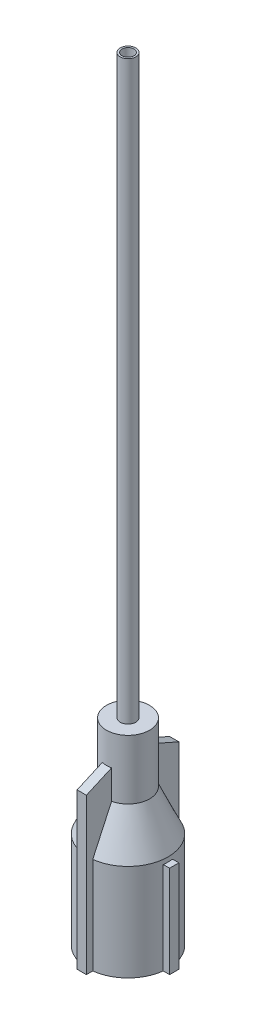
ISO-10303-21;
HEADER;
FILE_DESCRIPTION(('STEP AP214'),'2;1');
FILE_NAME('part.step','',(''),(''),'','','');
FILE_SCHEMA(('AUTOMOTIVE_DESIGN { 1 0 10303 214 1 1 1 1 }'));
ENDSEC;
DATA;
#1=APPLICATION_CONTEXT('core data for automotive mechanical design processes');
#2=APPLICATION_PROTOCOL_DEFINITION('international standard','automotive_design',2000,#1);
#3=PRODUCT_CONTEXT('',#1,'mechanical');
#4=PRODUCT('Part','Part','',(#3));
#5=PRODUCT_RELATED_PRODUCT_CATEGORY('part','',(#4));
#6=PRODUCT_DEFINITION_FORMATION('','',#4);
#7=PRODUCT_DEFINITION_CONTEXT('part definition',#1,'design');
#8=PRODUCT_DEFINITION('design','',#6,#7);
#9=PRODUCT_DEFINITION_SHAPE('','',#8);
#10=(LENGTH_UNIT() NAMED_UNIT(*) SI_UNIT(.MILLI.,.METRE.));
#11=(NAMED_UNIT(*) PLANE_ANGLE_UNIT() SI_UNIT($,.RADIAN.));
#12=(NAMED_UNIT(*) SI_UNIT($,.STERADIAN.) SOLID_ANGLE_UNIT());
#13=UNCERTAINTY_MEASURE_WITH_UNIT(LENGTH_MEASURE(1.E-05),#10,'distance_accuracy_value','');
#14=(GEOMETRIC_REPRESENTATION_CONTEXT(3) GLOBAL_UNCERTAINTY_ASSIGNED_CONTEXT((#13)) GLOBAL_UNIT_ASSIGNED_CONTEXT((#10,
#11,#12)) REPRESENTATION_CONTEXT('',''));
#15=CARTESIAN_POINT('',(0.,0.,0.));
#16=DIRECTION('',(0.,0.,1.));
#17=DIRECTION('',(1.,0.,0.));
#18=AXIS2_PLACEMENT_3D('',#15,#16,#17);
#19=CARTESIAN_POINT('',(0.,4.318,0.));
#20=DIRECTION('',(0.,1.,0.));
#21=DIRECTION('',(0.,0.,1.));
#22=AXIS2_PLACEMENT_3D('',#19,#20,#21);
#23=PLANE('',#22);
#24=DIRECTION('',(0.,0.,-1.));
#25=VECTOR('',#24,1.);
#26=CARTESIAN_POINT('',(3.15908511281352,4.318,-0.3175));
#27=LINE('',#26,#25);
#28=CARTESIAN_POINT('',(3.15908511281352,4.318,0.3175));
#29=VERTEX_POINT('',#28);
#30=CARTESIAN_POINT('',(3.15908511281352,4.318,-0.3175));
#31=VERTEX_POINT('',#30);
#32=EDGE_CURVE('E380',#29,#31,#27,.T.);
#33=ORIENTED_EDGE('',*,*,#32,.F.);
#34=DIRECTION('',(1.,0.,0.));
#35=VECTOR('',#34,1.);
#36=CARTESIAN_POINT('',(-3.15908511281352,4.318,0.3175));
#37=LINE('',#36,#35);
#38=CARTESIAN_POINT('',(2.72476420814719,4.318,0.3175));
#39=VERTEX_POINT('',#38);
#40=EDGE_CURVE('E389',#39,#29,#37,.T.);
#41=ORIENTED_EDGE('',*,*,#40,.F.);
#42=CARTESIAN_POINT('',(0.,4.318,0.));
#43=DIRECTION('',(0.,1.,0.));
#44=DIRECTION('',(0.,0.,1.));
#45=AXIS2_PLACEMENT_3D('',#42,#43,#44);
#46=CIRCLE('',#45,2.7432);
#47=CARTESIAN_POINT('',(0.3175,4.318,2.72476420814719));
#48=VERTEX_POINT('',#47);
#49=EDGE_CURVE('E404',#48,#39,#46,.T.);
#50=ORIENTED_EDGE('',*,*,#49,.F.);
#51=DIRECTION('',(0.,0.,-1.));
#52=VECTOR('',#51,1.);
#53=CARTESIAN_POINT('',(0.3175,4.318,-3.15908511281352));
#54=LINE('',#53,#52);
#55=CARTESIAN_POINT('',(0.3175,4.318,3.15908511281352));
#56=VERTEX_POINT('',#55);
#57=EDGE_CURVE('E394',#56,#48,#54,.T.);
#58=ORIENTED_EDGE('',*,*,#57,.F.);
#59=DIRECTION('',(1.,0.,0.));
#60=VECTOR('',#59,1.);
#61=CARTESIAN_POINT('',(-0.3175,4.318,3.15908511281352));
#62=LINE('',#61,#60);
#63=CARTESIAN_POINT('',(-0.3175,4.318,3.15908511281352));
#64=VERTEX_POINT('',#63);
#65=EDGE_CURVE('E400',#64,#56,#62,.T.);
#66=ORIENTED_EDGE('',*,*,#65,.F.);
#67=DIRECTION('',(0.,0.,1.));
#68=VECTOR('',#67,1.);
#69=CARTESIAN_POINT('',(-0.3175,4.318,-3.15908511281352));
#70=LINE('',#69,#68);
#71=CARTESIAN_POINT('',(-0.3175,4.318,2.72476420814719));
#72=VERTEX_POINT('',#71);
#73=EDGE_CURVE('E391',#72,#64,#70,.T.);
#74=ORIENTED_EDGE('',*,*,#73,.F.);
#75=CARTESIAN_POINT('',(0.,4.318,0.));
#76=DIRECTION('',(0.,1.,0.));
#77=DIRECTION('',(0.,0.,1.));
#78=AXIS2_PLACEMENT_3D('',#75,#76,#77);
#79=CIRCLE('',#78,2.7432);
#80=CARTESIAN_POINT('',(-2.72476420814719,4.318,0.3175));
#81=VERTEX_POINT('',#80);
#82=EDGE_CURVE('E54',#81,#72,#79,.T.);
#83=ORIENTED_EDGE('',*,*,#82,.F.);
#84=DIRECTION('',(1.,0.,0.));
#85=VECTOR('',#84,1.);
#86=CARTESIAN_POINT('',(-3.15908511281352,4.318,0.3175));
#87=LINE('',#86,#85);
#88=CARTESIAN_POINT('',(-3.15908511281352,4.318,0.3175));
#89=VERTEX_POINT('',#88);
#90=EDGE_CURVE('E388',#89,#81,#87,.T.);
#91=ORIENTED_EDGE('',*,*,#90,.F.);
#92=DIRECTION('',(0.,0.,1.));
#93=VECTOR('',#92,1.);
#94=CARTESIAN_POINT('',(-3.15908511281352,4.318,-0.3175));
#95=LINE('',#94,#93);
#96=CARTESIAN_POINT('',(-3.15908511281352,4.318,-0.3175));
#97=VERTEX_POINT('',#96);
#98=EDGE_CURVE('E62',#97,#89,#95,.T.);
#99=ORIENTED_EDGE('',*,*,#98,.F.);
#100=DIRECTION('',(-1.,0.,0.));
#101=VECTOR('',#100,1.);
#102=CARTESIAN_POINT('',(-3.15908511281352,4.318,-0.3175));
#103=LINE('',#102,#101);
#104=CARTESIAN_POINT('',(-2.72476420814719,4.318,-0.3175));
#105=VERTEX_POINT('',#104);
#106=EDGE_CURVE('E70',#105,#97,#103,.T.);
#107=ORIENTED_EDGE('',*,*,#106,.F.);
#108=CARTESIAN_POINT('',(-0.3175,4.318,-2.72476420814719));
#109=VERTEX_POINT('',#108);
#110=EDGE_CURVE('E13',#109,#105,#79,.T.);
#111=ORIENTED_EDGE('',*,*,#110,.F.);
#112=DIRECTION('',(0.,0.,1.));
#113=VECTOR('',#112,1.);
#114=CARTESIAN_POINT('',(-0.3175,4.318,-3.15908511281352));
#115=LINE('',#114,#113);
#116=CARTESIAN_POINT('',(-0.3175,4.318,-3.15908511281352));
#117=VERTEX_POINT('',#116);
#118=EDGE_CURVE('E393',#117,#109,#115,.T.);
#119=ORIENTED_EDGE('',*,*,#118,.F.);
#120=DIRECTION('',(-1.,0.,0.));
#121=VECTOR('',#120,1.);
#122=CARTESIAN_POINT('',(-0.3175,4.318,-3.15908511281352));
#123=LINE('',#122,#121);
#124=CARTESIAN_POINT('',(0.3175,4.318,-3.15908511281352));
#125=VERTEX_POINT('',#124);
#126=EDGE_CURVE('E397',#125,#117,#123,.T.);
#127=ORIENTED_EDGE('',*,*,#126,.F.);
#128=DIRECTION('',(0.,0.,-1.));
#129=VECTOR('',#128,1.);
#130=CARTESIAN_POINT('',(0.3175,4.318,-3.15908511281352));
#131=LINE('',#130,#129);
#132=CARTESIAN_POINT('',(0.3175,4.318,-2.72476420814719));
#133=VERTEX_POINT('',#132);
#134=EDGE_CURVE('E396',#133,#125,#131,.T.);
#135=ORIENTED_EDGE('',*,*,#134,.F.);
#136=CARTESIAN_POINT('',(2.72476420814719,4.318,-0.3175));
#137=VERTEX_POINT('',#136);
#138=EDGE_CURVE('E399',#137,#133,#46,.T.);
#139=ORIENTED_EDGE('',*,*,#138,.F.);
#140=DIRECTION('',(-1.,0.,0.));
#141=VECTOR('',#140,1.);
#142=CARTESIAN_POINT('',(-3.15908511281352,4.318,-0.3175));
#143=LINE('',#142,#141);
#144=EDGE_CURVE('E49',#31,#137,#143,.T.);
#145=ORIENTED_EDGE('',*,*,#144,.F.);
#146=EDGE_LOOP('',(#33,#41,#50,#58,#66,#74,#83,#91,#99,#107,#111,#119,#127,#135,#139,#145));
#147=FACE_BOUND('',#146,.T.);
#148=CARTESIAN_POINT('',(0.,4.318,0.));
#149=DIRECTION('',(0.,1.,0.));
#150=DIRECTION('',(0.,0.,1.));
#151=AXIS2_PLACEMENT_3D('',#148,#149,#150);
#152=CIRCLE('',#151,2.1209);
#153=CARTESIAN_POINT('',(0.,4.318,2.1209));
#154=VERTEX_POINT('',#153);
#155=EDGE_CURVE('E336',#154,#154,#152,.F.);
#156=ORIENTED_EDGE('',*,*,#155,.F.);
#157=EDGE_LOOP('',(#156));
#158=FACE_BOUND('',#157,.T.);
#159=ADVANCED_FACE('F46',(#147,#158),#23,.F.);
#160=CARTESIAN_POINT('',(0.,115.80868302834,0.));
#161=DIRECTION('',(0.,-1.,0.));
#162=DIRECTION('',(0.,0.,-1.));
#163=AXIS2_PLACEMENT_3D('',#160,#161,#162);
#164=CYLINDRICAL_SURFACE('',#163,0.5334);
#165=CARTESIAN_POINT('',(0.,17.78,0.));
#166=DIRECTION('',(0.,1.,0.));
#167=DIRECTION('',(0.,0.,1.));
#168=AXIS2_PLACEMENT_3D('',#165,#166,#167);
#169=CIRCLE('',#168,0.5334);
#170=CARTESIAN_POINT('',(0.,17.78,0.5334));
#171=VERTEX_POINT('',#170);
#172=EDGE_CURVE('E333',#171,#171,#169,.T.);
#173=ORIENTED_EDGE('',*,*,#172,.T.);
#174=EDGE_LOOP('',(#173));
#175=FACE_BOUND('',#174,.T.);
#176=CARTESIAN_POINT('',(0.,57.15,0.));
#177=DIRECTION('',(0.,1.,0.));
#178=DIRECTION('',(0.,0.,1.));
#179=AXIS2_PLACEMENT_3D('',#176,#177,#178);
#180=CIRCLE('',#179,0.5334);
#181=CARTESIAN_POINT('',(0.,57.15,0.5334));
#182=VERTEX_POINT('',#181);
#183=EDGE_CURVE('E341',#182,#182,#180,.F.);
#184=ORIENTED_EDGE('',*,*,#183,.T.);
#185=EDGE_LOOP('',(#184));
#186=FACE_BOUND('',#185,.T.);
#187=ADVANCED_FACE('F367',(#175,#186),#164,.T.);
#188=CARTESIAN_POINT('',(-7.3025,15.6972,-3.15908511281352));
#189=DIRECTION('',(0.,1.,0.));
#190=DIRECTION('',(0.,0.,1.));
#191=AXIS2_PLACEMENT_3D('',#188,#189,#190);
#192=PLANE('',#191);
#193=CARTESIAN_POINT('',(0.,15.6972,0.));
#194=DIRECTION('',(0.,1.,0.));
#195=DIRECTION('',(0.,0.,1.));
#196=AXIS2_PLACEMENT_3D('',#193,#194,#195);
#197=CIRCLE('',#196,1.4732);
#198=CARTESIAN_POINT('',(-0.317500000000002,15.6972,-1.43857985179829));
#199=VERTEX_POINT('',#198);
#200=CARTESIAN_POINT('',(0.3175,15.6972,-1.43857985179829));
#201=VERTEX_POINT('',#200);
#202=EDGE_CURVE('E214',#199,#201,#197,.F.);
#203=ORIENTED_EDGE('',*,*,#202,.T.);
#204=DIRECTION('',(1.,0.,0.));
#205=VECTOR('',#204,1.);
#206=CARTESIAN_POINT('',(-7.3025,15.6972,-1.43857985179829));
#207=LINE('',#206,#205);
#208=EDGE_CURVE('E320',#199,#201,#207,.T.);
#209=ORIENTED_EDGE('',*,*,#208,.F.);
#210=EDGE_LOOP('',(#203,#209));
#211=FACE_BOUND('',#210,.T.);
#212=ADVANCED_FACE('F373',(#211),#192,.F.);
#213=CARTESIAN_POINT('',(0.,17.78,0.));
#214=DIRECTION('',(0.,1.,0.));
#215=DIRECTION('',(0.,0.,1.));
#216=AXIS2_PLACEMENT_3D('',#213,#214,#215);
#217=PLANE('',#216);
#218=ORIENTED_EDGE('',*,*,#172,.F.);
#219=EDGE_LOOP('',(#218));
#220=FACE_BOUND('',#219,.T.);
#221=CARTESIAN_POINT('',(0.,17.78,0.));
#222=DIRECTION('',(0.,1.,0.));
#223=DIRECTION('',(0.,0.,1.));
#224=AXIS2_PLACEMENT_3D('',#221,#222,#223);
#225=CIRCLE('',#224,1.4732);
#226=CARTESIAN_POINT('',(0.,17.78,1.4732));
#227=VERTEX_POINT('',#226);
#228=EDGE_CURVE('E215',#227,#227,#225,.T.);
#229=ORIENTED_EDGE('',*,*,#228,.T.);
#230=EDGE_LOOP('',(#229));
#231=FACE_BOUND('',#230,.T.);
#232=ADVANCED_FACE('F507',(#220,#231),#217,.T.);
#233=CARTESIAN_POINT('',(-7.3025,15.6972,1.43857985179829));
#234=DIRECTION('',(0.,1.,0.));
#235=DIRECTION('',(0.,0.,1.));
#236=AXIS2_PLACEMENT_3D('',#233,#234,#235);
#237=PLANE('',#236);
#238=CARTESIAN_POINT('',(0.3175,15.6972,1.43857985179829));
#239=VERTEX_POINT('',#238);
#240=CARTESIAN_POINT('',(-0.317500000000002,15.6972,1.43857985179829));
#241=VERTEX_POINT('',#240);
#242=EDGE_CURVE('E189',#239,#241,#197,.F.);
#243=ORIENTED_EDGE('',*,*,#242,.T.);
#244=DIRECTION('',(1.,0.,0.));
#245=VECTOR('',#244,1.);
#246=CARTESIAN_POINT('',(-7.3025,15.6972,1.43857985179829));
#247=LINE('',#246,#245);
#248=EDGE_CURVE('E185',#241,#239,#247,.T.);
#249=ORIENTED_EDGE('',*,*,#248,.T.);
#250=EDGE_LOOP('',(#243,#249));
#251=FACE_BOUND('',#250,.T.);
#252=ADVANCED_FACE('F187',(#251),#237,.F.);
#253=CARTESIAN_POINT('',(-7.3025,15.6972,-1.43857985179829));
#254=DIRECTION('',(0.,-0.914337198757473,0.404953684966982));
#255=DIRECTION('',(0.,-0.404953684966982,-0.914337198757473));
#256=AXIS2_PLACEMENT_3D('',#253,#254,#255);
#257=PLANE('',#256);
#258=ORIENTED_EDGE('',*,*,#208,.T.);
#259=DIRECTION('',(0.,-0.404953684966982,-0.914337198757473));
#260=VECTOR('',#259,1.);
#261=CARTESIAN_POINT('',(0.3175,15.6972,-1.43857985179829));
#262=LINE('',#261,#260);
#263=CARTESIAN_POINT('',(0.3175,14.9352,-3.15908511281352));
#264=VERTEX_POINT('',#263);
#265=EDGE_CURVE('E323',#201,#264,#262,.T.);
#266=ORIENTED_EDGE('',*,*,#265,.T.);
#267=DIRECTION('',(1.,0.,0.));
#268=VECTOR('',#267,1.);
#269=CARTESIAN_POINT('',(-7.3025,14.9352,-3.15908511281352));
#270=LINE('',#269,#268);
#271=CARTESIAN_POINT('',(-0.3175,14.9352,-3.15908511281352));
#272=VERTEX_POINT('',#271);
#273=EDGE_CURVE('E319',#272,#264,#270,.T.);
#274=ORIENTED_EDGE('',*,*,#273,.F.);
#275=DIRECTION('',(0.,-0.404953684966982,-0.914337198757473));
#276=VECTOR('',#275,1.);
#277=CARTESIAN_POINT('',(-0.3175,15.0601584650699,-2.87694377874383));
#278=LINE('',#277,#276);
#279=EDGE_CURVE('E316',#199,#272,#278,.T.);
#280=ORIENTED_EDGE('',*,*,#279,.F.);
#281=EDGE_LOOP('',(#258,#266,#274,#280));
#282=FACE_BOUND('',#281,.T.);
#283=ADVANCED_FACE('F498',(#282),#257,.F.);
#284=CARTESIAN_POINT('',(0.,13.716,0.));
#285=DIRECTION('',(0.,-1.,0.));
#286=DIRECTION('',(0.,0.,-1.));
#287=AXIS2_PLACEMENT_3D('',#284,#285,#286);
#288=CONICAL_SURFACE('',#287,1.4732,0.426627493126876);
#289=CARTESIAN_POINT('',(-0.3175,7.22767932714699,-4.41102480672568));
#290=CARTESIAN_POINT('',(-0.3175,7.7021106698669,-4.19480163593372));
#291=CARTESIAN_POINT('',(-0.3175,8.17652163046673,-3.97853367098987));
#292=CARTESIAN_POINT('',(-0.3175,9.1252505790544,-3.54576802046189));
#293=CARTESIAN_POINT('',(-0.3175,9.59956856492115,-3.32927033022839));
#294=CARTESIAN_POINT('',(-0.3175,10.5479583789697,-2.89595119700704));
#295=CARTESIAN_POINT('',(-0.3175,11.0220302354266,-2.67912981595699));
#296=CARTESIAN_POINT('',(-0.3175,11.7328764011325,-2.35333794758448));
#297=CARTESIAN_POINT('',(-0.3175,11.9697794111443,-2.24464832915866));
#298=CARTESIAN_POINT('',(-0.3175,12.4434520948054,-2.02697902218213));
#299=CARTESIAN_POINT('',(-0.3175,12.6802217685209,-1.91799933377566));
#300=CARTESIAN_POINT('',(-0.3175,13.0843295725296,-1.73150430729163));
#301=CARTESIAN_POINT('',(-0.3175,13.2517226186287,-1.65410799082424));
#302=CARTESIAN_POINT('',(-0.3175,13.5863487208074,-1.49895327810397));
#303=CARTESIAN_POINT('',(-0.3175,13.7535817706139,-1.42119486830339));
#304=CARTESIAN_POINT('',(-0.3175,14.0878037978454,-1.26508834298285));
#305=CARTESIAN_POINT('',(-0.3175,14.2547927337769,-1.18674013860669));
#306=CARTESIAN_POINT('',(-0.3175,14.5882884954842,-1.02906613000263));
#307=CARTESIAN_POINT('',(-0.3175,14.7547953723236,-0.949740434374789));
#308=CARTESIAN_POINT('',(-0.3175,15.0037781743311,-0.829246154237625));
#309=CARTESIAN_POINT('',(-0.3175,15.0866222224287,-0.788840737330407));
#310=CARTESIAN_POINT('',(-0.3175,15.2519357639856,-0.707211137899544));
#311=CARTESIAN_POINT('',(-0.3175,15.3344051425115,-0.665986722564364));
#312=CARTESIAN_POINT('',(-0.3175,15.4987490876982,-0.582193332007994));
#313=CARTESIAN_POINT('',(-0.3175,15.5806231387277,-0.539623330450745));
#314=CARTESIAN_POINT('',(-0.3175,15.7023956437923,-0.473880389828178));
#315=CARTESIAN_POINT('',(-0.3175,15.7428048004217,-0.45165640474891));
#316=CARTESIAN_POINT('',(-0.3175,15.8230874644223,-0.406264474078921));
#317=CARTESIAN_POINT('',(-0.3175,15.8629610584932,-0.383096683786355));
#318=CARTESIAN_POINT('',(-0.3175,15.9218400538252,-0.347371160104113));
#319=CARTESIAN_POINT('',(-0.3175,15.9411886901245,-0.335381134093842));
#320=CARTESIAN_POINT('',(-0.3175,15.979580480711,-0.310917780370954));
#321=CARTESIAN_POINT('',(-0.3175,15.9986236127448,-0.298444417675352));
#322=CARTESIAN_POINT('',(-0.3175,16.0362211538037,-0.272895179415757));
#323=CARTESIAN_POINT('',(-0.3175,16.0547769209849,-0.259821339655033));
#324=CARTESIAN_POINT('',(-0.3175,16.0912253300294,-0.232787238041285));
#325=CARTESIAN_POINT('',(-0.3175,16.1091178964841,-0.218826875873773));
#326=CARTESIAN_POINT('',(-0.3175,16.1496366461539,-0.184822510126191));
#327=CARTESIAN_POINT('',(-0.3175,16.1718840482779,-0.16428782169052));
#328=CARTESIAN_POINT('',(-0.3175,16.2022073654761,-0.130460393372264));
#329=CARTESIAN_POINT('',(-0.3175,16.2118539003325,-0.118602883955266));
#330=CARTESIAN_POINT('',(-0.3175,16.2292948533368,-0.0935863424134843));
#331=CARTESIAN_POINT('',(-0.3175,16.2370963025341,-0.0804325309107127));
#332=CARTESIAN_POINT('',(-0.3175,16.2470020273625,-0.058480457761505));
#333=CARTESIAN_POINT('',(-0.3175,16.2501257771589,-0.0501504550969108));
#334=CARTESIAN_POINT('',(-0.3175,16.2549996431112,-0.0330996577408318));
#335=CARTESIAN_POINT('',(-0.3175,16.2567522543127,-0.0243796035462129));
#336=CARTESIAN_POINT('',(-0.3175,16.2586558057003,-0.00669680389599933));
#337=CARTESIAN_POINT('',(-0.3175,16.2587953742625,0.00226721858937595));
#338=CARTESIAN_POINT('',(-0.3175,16.2574206264703,0.020069253483007));
#339=CARTESIAN_POINT('',(-0.3175,16.2559048128029,0.0289071444731656));
#340=CARTESIAN_POINT('',(-0.3175,16.2509530707759,0.0480738070442011));
#341=CARTESIAN_POINT('',(-0.3175,16.2471725102118,0.0583111450000653));
#342=CARTESIAN_POINT('',(-0.3175,16.2380540779672,0.0780624072184146));
#343=CARTESIAN_POINT('',(-0.3175,16.2327125003723,0.0875745412676681));
#344=CARTESIAN_POINT('',(-0.3175,16.2199926536065,0.107413138145903));
#345=CARTESIAN_POINT('',(-0.3175,16.212423710857,0.117614623300637));
#346=CARTESIAN_POINT('',(-0.3175,16.1963352377141,0.137248197102446));
#347=CARTESIAN_POINT('',(-0.3175,16.1878139939425,0.146678844332645));
#348=CARTESIAN_POINT('',(-0.3175,16.1700809478357,0.164975944958832));
#349=CARTESIAN_POINT('',(-0.3175,16.1608650915871,0.17383842080837));
#350=CARTESIAN_POINT('',(-0.3175,16.1419907214362,0.19105553887496));
#351=CARTESIAN_POINT('',(-0.3175,16.132332614341,0.199410631981544));
#352=CARTESIAN_POINT('',(-0.3175,16.1013339168907,0.225168535603576));
#353=CARTESIAN_POINT('',(-0.3175,16.079402931261,0.241857503806441));
#354=CARTESIAN_POINT('',(-0.3175,16.0346960659354,0.274071126844144));
#355=CARTESIAN_POINT('',(-0.3175,16.0119194785766,0.289594772054586));
#356=CARTESIAN_POINT('',(-0.3175,15.9427059604232,0.335050019394471));
#357=CARTESIAN_POINT('',(-0.3175,15.8954891386935,0.363787031853922));
#358=CARTESIAN_POINT('',(-0.3175,15.8000436263016,0.419607615059472));
#359=CARTESIAN_POINT('',(-0.3175,15.7518138204016,0.44668921960024));
#360=CARTESIAN_POINT('',(-0.3175,15.6548557945915,0.499758887550107));
#361=CARTESIAN_POINT('',(-0.3175,15.6061284863242,0.525748616948857));
#362=CARTESIAN_POINT('',(-0.3175,15.4604370911632,0.602177555958504));
#363=CARTESIAN_POINT('',(-0.3175,15.3629624872617,0.651636997317587));
#364=CARTESIAN_POINT('',(-0.3175,15.1673516294104,0.749238064179454));
#365=CARTESIAN_POINT('',(-0.3175,15.0692153134667,0.7973795640082));
#366=CARTESIAN_POINT('',(-0.3175,14.872479265547,0.892908502560198));
#367=CARTESIAN_POINT('',(-0.3175,14.7738792248004,0.940295304929104));
#368=CARTESIAN_POINT('',(-0.3175,14.5764424176428,1.03456117845374));
#369=CARTESIAN_POINT('',(-0.3175,14.4776056611519,1.08144027044678));
#370=CARTESIAN_POINT('',(-0.3175,14.181536310037,1.22125219555609));
#371=CARTESIAN_POINT('',(-0.3175,13.9840677517306,1.31368495889932));
#372=CARTESIAN_POINT('',(-0.3175,13.5888719078028,1.49783399248739));
#373=CARTESIAN_POINT('',(-0.3175,13.3911447205553,1.58955047456235));
#374=CARTESIAN_POINT('',(-0.3175,12.9459164305719,1.79550730293358));
#375=CARTESIAN_POINT('',(-0.3175,12.6983614964152,1.9096312685947));
#376=CARTESIAN_POINT('',(-0.3175,12.2030809475721,2.13750900113742));
#377=CARTESIAN_POINT('',(-0.3175,11.9553553325693,2.25126276733027));
#378=CARTESIAN_POINT('',(-0.3175,11.2119545386823,2.59220985859512));
#379=CARTESIAN_POINT('',(-0.3175,10.7161213495256,2.81905858675671));
#380=CARTESIAN_POINT('',(-0.3175,9.72154818333632,3.27358073909779));
#381=CARTESIAN_POINT('',(-0.3175,9.22280716129733,3.501251874118));
#382=CARTESIAN_POINT('',(-0.3175,8.22527751972674,3.95630562286426));
#383=CARTESIAN_POINT('',(-0.3175,7.72648891653276,4.18368827239904));
#384=CARTESIAN_POINT('',(-0.3175,7.22767932714699,4.41102480672568));
#385=B_SPLINE_CURVE_WITH_KNOTS('',3,(#289,#290,#291,#292,#293,#294,#295,#296,#297,#298,#299,
#300,#301,#302,#303,#304,#305,#306,#307,#308,#309,#310,#311,#312,#313,#314,#315,#316,#317,#318,
#319,#320,#321,#322,#323,#324,#325,#326,#327,#328,#329,#330,#331,#332,#333,#334,#335,#336,#337,
#338,#339,#340,#341,#342,#343,#344,#345,#346,#347,#348,#349,#350,#351,#352,#353,#354,#355,#356,
#357,#358,#359,#360,#361,#362,#363,#364,#365,#366,#367,#368,#369,#370,#371,#372,#373,#374,#375,
#376,#377,#378,#379,#380,#381,#382,#383,#384),.UNSPECIFIED.,.F.,.F.,(4,2,2,2,2,2,2,2,2,2,2,2,2,
2,2,2,2,2,2,2,2,2,2,2,2,2,2,2,2,2,2,2,2,2,2,2,2,2,2,2,2,2,2,2,2,2,2,4),(0.,1.56414133526905,
3.12831495479998,4.69222013577117,5.47415879826696,6.25609707199398,6.80935592824491,
7.36263565369306,7.91600047238721,8.46930435638963,8.74581794354609,9.02241129120681,
9.2992209564616,9.43756626673929,9.5758889042541,9.64417066382184,9.71245737475775,
9.78052756733815,9.84860547617722,9.93907552029508,9.9848426173377,10.0304323940226,
10.0570304090863,10.0835799107289,10.1103164677461,10.1370772283434,10.1696312059669,
10.202263104674,10.2402845141526,10.2783754678167,10.3167091145838,10.3550081817406,
10.4376100125381,10.5202826019894,10.6860180835875,10.851946737879,11.0176122697718,
11.345503117697,11.673425123939,12.0016103731399,12.3297821016229,12.9838726636833,
13.6377618463809,14.455544462398,15.2733285990193,16.9091146856415,18.5538610741755,
20.1983780896986),.UNSPECIFIED.);
#386=CARTESIAN_POINT('',(-0.3175,10.922,-2.72476420814719));
#387=VERTEX_POINT('',#386);
#388=CARTESIAN_POINT('',(-0.3175,13.716,-1.43857985179829));
#389=VERTEX_POINT('',#388);
#390=EDGE_CURVE('E240',#387,#389,#385,.T.);
#391=ORIENTED_EDGE('',*,*,#390,.F.);
#392=CARTESIAN_POINT('',(0.,10.922,0.));
#393=DIRECTION('',(0.,-1.,0.));
#394=DIRECTION('',(0.,0.,-1.));
#395=AXIS2_PLACEMENT_3D('',#392,#393,#394);
#396=CIRCLE('',#395,2.7432);
#397=CARTESIAN_POINT('',(-0.3175,10.922,2.72476420814719));
#398=VERTEX_POINT('',#397);
#399=EDGE_CURVE('E467',#398,#387,#396,.T.);
#400=ORIENTED_EDGE('',*,*,#399,.F.);
#401=CARTESIAN_POINT('',(-0.3175,13.716,1.43857985179829));
#402=VERTEX_POINT('',#401);
#403=EDGE_CURVE('E231',#402,#398,#385,.T.);
#404=ORIENTED_EDGE('',*,*,#403,.F.);
#405=CARTESIAN_POINT('',(0.,13.716,0.));
#406=DIRECTION('',(0.,-1.,0.));
#407=DIRECTION('',(0.,0.,-1.));
#408=AXIS2_PLACEMENT_3D('',#405,#406,#407);
#409=CIRCLE('',#408,1.4732);
#410=EDGE_CURVE('E487',#402,#389,#409,.T.);
#411=ORIENTED_EDGE('',*,*,#410,.T.);
#412=EDGE_LOOP('',(#391,#400,#404,#411));
#413=FACE_BOUND('',#412,.T.);
#414=ADVANCED_FACE('F242',(#413),#288,.T.);
#415=CARTESIAN_POINT('',(0.,17.78,0.));
#416=DIRECTION('',(0.,-1.,0.));
#417=DIRECTION('',(0.,0.,-1.));
#418=AXIS2_PLACEMENT_3D('',#415,#416,#417);
#419=CYLINDRICAL_SURFACE('',#418,2.7432);
#420=DIRECTION('',(0.,-1.,0.));
#421=VECTOR('',#420,1.);
#422=CARTESIAN_POINT('',(-0.3175,17.78,-2.72476420814719));
#423=LINE('',#422,#421);
#424=EDGE_CURVE('E460',#109,#387,#423,.F.);
#425=ORIENTED_EDGE('',*,*,#424,.F.);
#426=ORIENTED_EDGE('',*,*,#110,.T.);
#427=DIRECTION('',(0.,-1.,0.));
#428=VECTOR('',#427,1.);
#429=CARTESIAN_POINT('',(-2.72476420814719,17.78,-0.3175));
#430=LINE('',#429,#428);
#431=CARTESIAN_POINT('',(-2.72476420814719,10.6172,-0.3175));
#432=VERTEX_POINT('',#431);
#433=EDGE_CURVE('E288',#432,#105,#430,.T.);
#434=ORIENTED_EDGE('',*,*,#433,.F.);
#435=CARTESIAN_POINT('',(0.,10.6172,0.));
#436=DIRECTION('',(0.,1.,0.));
#437=DIRECTION('',(0.,0.,1.));
#438=AXIS2_PLACEMENT_3D('',#435,#436,#437);
#439=CIRCLE('',#438,2.7432);
#440=CARTESIAN_POINT('',(-2.72476420814719,10.6172,0.3175));
#441=VERTEX_POINT('',#440);
#442=EDGE_CURVE('E280',#432,#441,#439,.T.);
#443=ORIENTED_EDGE('',*,*,#442,.T.);
#444=DIRECTION('',(0.,-1.,0.));
#445=VECTOR('',#444,1.);
#446=CARTESIAN_POINT('',(-2.72476420814719,17.78,0.3175));
#447=LINE('',#446,#445);
#448=EDGE_CURVE('E283',#81,#441,#447,.F.);
#449=ORIENTED_EDGE('',*,*,#448,.F.);
#450=ORIENTED_EDGE('',*,*,#82,.T.);
#451=DIRECTION('',(0.,-1.,0.));
#452=VECTOR('',#451,1.);
#453=CARTESIAN_POINT('',(-0.3175,17.78,2.72476420814719));
#454=LINE('',#453,#452);
#455=EDGE_CURVE('E239',#398,#72,#454,.T.);
#456=ORIENTED_EDGE('',*,*,#455,.F.);
#457=ORIENTED_EDGE('',*,*,#399,.T.);
#458=EDGE_LOOP('',(#425,#426,#434,#443,#449,#450,#456,#457));
#459=FACE_BOUND('',#458,.T.);
#460=ADVANCED_FACE('F433',(#459),#419,.T.);
#461=CARTESIAN_POINT('',(0.,10.6172,0.));
#462=DIRECTION('',(0.,1.,0.));
#463=DIRECTION('',(0.,0.,1.));
#464=AXIS2_PLACEMENT_3D('',#461,#462,#463);
#465=PLANE('',#464);
#466=ORIENTED_EDGE('',*,*,#442,.F.);
#467=DIRECTION('',(-1.,0.,0.));
#468=VECTOR('',#467,1.);
#469=CARTESIAN_POINT('',(-3.15908511281352,10.6172,-0.3175));
#470=LINE('',#469,#468);
#471=CARTESIAN_POINT('',(-3.15908511281352,10.6172,-0.3175));
#472=VERTEX_POINT('',#471);
#473=EDGE_CURVE('E306',#432,#472,#470,.T.);
#474=ORIENTED_EDGE('',*,*,#473,.T.);
#475=DIRECTION('',(0.,0.,1.));
#476=VECTOR('',#475,1.);
#477=CARTESIAN_POINT('',(-3.15908511281352,10.6172,-0.3175));
#478=LINE('',#477,#476);
#479=CARTESIAN_POINT('',(-3.15908511281352,10.6172,0.3175));
#480=VERTEX_POINT('',#479);
#481=EDGE_CURVE('E313',#472,#480,#478,.T.);
#482=ORIENTED_EDGE('',*,*,#481,.T.);
#483=DIRECTION('',(1.,0.,0.));
#484=VECTOR('',#483,1.);
#485=CARTESIAN_POINT('',(-3.15908511281352,10.6172,0.3175));
#486=LINE('',#485,#484);
#487=EDGE_CURVE('E309',#480,#441,#486,.T.);
#488=ORIENTED_EDGE('',*,*,#487,.T.);
#489=EDGE_LOOP('',(#466,#474,#482,#488));
#490=FACE_BOUND('',#489,.T.);
#491=ADVANCED_FACE('F436',(#490),#465,.T.);
#492=CARTESIAN_POINT('',(-3.15908511281352,10.6172,0.3175));
#493=DIRECTION('',(0.,0.,-1.));
#494=DIRECTION('',(-1.,0.,0.));
#495=AXIS2_PLACEMENT_3D('',#492,#493,#494);
#496=PLANE('',#495);
#497=DIRECTION('',(0.,-1.,0.));
#498=VECTOR('',#497,1.);
#499=CARTESIAN_POINT('',(-3.15908511281352,10.6172,0.3175));
#500=LINE('',#499,#498);
#501=EDGE_CURVE('E292',#480,#89,#500,.T.);
#502=ORIENTED_EDGE('',*,*,#501,.T.);
#503=ORIENTED_EDGE('',*,*,#90,.T.);
#504=ORIENTED_EDGE('',*,*,#448,.T.);
#505=ORIENTED_EDGE('',*,*,#487,.F.);
#506=EDGE_LOOP('',(#502,#503,#504,#505));
#507=FACE_BOUND('',#506,.T.);
#508=ADVANCED_FACE('F440',(#507),#496,.F.);
#509=CARTESIAN_POINT('',(-3.15908511281352,10.6172,-0.3175));
#510=DIRECTION('',(0.,0.,1.));
#511=DIRECTION('',(1.,0.,0.));
#512=AXIS2_PLACEMENT_3D('',#509,#510,#511);
#513=PLANE('',#512);
#514=ORIENTED_EDGE('',*,*,#433,.T.);
#515=ORIENTED_EDGE('',*,*,#106,.T.);
#516=DIRECTION('',(0.,-1.,0.));
#517=VECTOR('',#516,1.);
#518=CARTESIAN_POINT('',(-3.15908511281352,10.6172,-0.3175));
#519=LINE('',#518,#517);
#520=EDGE_CURVE('E301',#472,#97,#519,.T.);
#521=ORIENTED_EDGE('',*,*,#520,.F.);
#522=ORIENTED_EDGE('',*,*,#473,.F.);
#523=EDGE_LOOP('',(#514,#515,#521,#522));
#524=FACE_BOUND('',#523,.T.);
#525=ADVANCED_FACE('F439',(#524),#513,.F.);
#526=CARTESIAN_POINT('',(-3.15908511281352,10.6172,-0.3175));
#527=DIRECTION('',(1.,0.,0.));
#528=DIRECTION('',(0.,0.,-1.));
#529=AXIS2_PLACEMENT_3D('',#526,#527,#528);
#530=PLANE('',#529);
#531=ORIENTED_EDGE('',*,*,#520,.T.);
#532=ORIENTED_EDGE('',*,*,#98,.T.);
#533=ORIENTED_EDGE('',*,*,#501,.F.);
#534=ORIENTED_EDGE('',*,*,#481,.F.);
#535=EDGE_LOOP('',(#531,#532,#533,#534));
#536=FACE_BOUND('',#535,.T.);
#537=ADVANCED_FACE('F443',(#536),#530,.F.);
#538=CARTESIAN_POINT('',(0.,13.716,0.));
#539=DIRECTION('',(0.,1.,0.));
#540=DIRECTION('',(0.,0.,1.));
#541=AXIS2_PLACEMENT_3D('',#538,#539,#540);
#542=CYLINDRICAL_SURFACE('',#541,1.4732);
#543=ORIENTED_EDGE('',*,*,#228,.F.);
#544=EDGE_LOOP('',(#543));
#545=FACE_BOUND('',#544,.T.);
#546=ORIENTED_EDGE('',*,*,#202,.F.);
#547=DIRECTION('',(0.,1.,0.));
#548=VECTOR('',#547,1.);
#549=CARTESIAN_POINT('',(-0.3175,13.716,-1.43857985179829));
#550=LINE('',#549,#548);
#551=EDGE_CURVE('E469',#199,#389,#550,.F.);
#552=ORIENTED_EDGE('',*,*,#551,.T.);
#553=ORIENTED_EDGE('',*,*,#410,.F.);
#554=DIRECTION('',(0.,1.,0.));
#555=VECTOR('',#554,1.);
#556=CARTESIAN_POINT('',(-0.3175,13.716,1.43857985179829));
#557=LINE('',#556,#555);
#558=EDGE_CURVE('E213',#402,#241,#557,.T.);
#559=ORIENTED_EDGE('',*,*,#558,.T.);
#560=ORIENTED_EDGE('',*,*,#242,.F.);
#561=DIRECTION('',(0.,1.,0.));
#562=VECTOR('',#561,1.);
#563=CARTESIAN_POINT('',(0.3175,13.716,1.43857985179829));
#564=LINE('',#563,#562);
#565=CARTESIAN_POINT('',(0.3175,13.716,1.43857985179829));
#566=VERTEX_POINT('',#565);
#567=EDGE_CURVE('E209',#239,#566,#564,.F.);
#568=ORIENTED_EDGE('',*,*,#567,.T.);
#569=CARTESIAN_POINT('',(0.3175,13.716,-1.43857985179829));
#570=VERTEX_POINT('',#569);
#571=EDGE_CURVE('E475',#570,#566,#409,.T.);
#572=ORIENTED_EDGE('',*,*,#571,.F.);
#573=DIRECTION('',(0.,1.,0.));
#574=VECTOR('',#573,1.);
#575=CARTESIAN_POINT('',(0.3175,13.716,-1.43857985179829));
#576=LINE('',#575,#574);
#577=EDGE_CURVE('E266',#570,#201,#576,.T.);
#578=ORIENTED_EDGE('',*,*,#577,.T.);
#579=EDGE_LOOP('',(#546,#552,#553,#559,#560,#568,#572,#578));
#580=FACE_BOUND('',#579,.T.);
#581=ADVANCED_FACE('F207',(#545,#580),#542,.T.);
#582=CARTESIAN_POINT('',(0.3175,7.22767932714699,4.41102480672568));
#583=CARTESIAN_POINT('',(0.3175,7.7021106698669,4.19480163593372));
#584=CARTESIAN_POINT('',(0.3175,8.17652163046673,3.97853367098987));
#585=CARTESIAN_POINT('',(0.3175,9.1252505790544,3.54576802046189));
#586=CARTESIAN_POINT('',(0.3175,9.59956856492115,3.32927033022839));
#587=CARTESIAN_POINT('',(0.3175,10.5479583789697,2.89595119700704));
#588=CARTESIAN_POINT('',(0.3175,11.0220302354266,2.67912981595699));
#589=CARTESIAN_POINT('',(0.3175,11.7328764011325,2.35333794758448));
#590=CARTESIAN_POINT('',(0.3175,11.9697794111443,2.24464832915866));
#591=CARTESIAN_POINT('',(0.3175,12.4434520948054,2.02697902218213));
#592=CARTESIAN_POINT('',(0.3175,12.6802217685209,1.91799933377566));
#593=CARTESIAN_POINT('',(0.3175,13.0843295725296,1.73150430729163));
#594=CARTESIAN_POINT('',(0.3175,13.2517226186287,1.65410799082424));
#595=CARTESIAN_POINT('',(0.3175,13.5863487208074,1.49895327810397));
#596=CARTESIAN_POINT('',(0.3175,13.7535817706139,1.42119486830339));
#597=CARTESIAN_POINT('',(0.3175,14.0878037978454,1.26508834298285));
#598=CARTESIAN_POINT('',(0.3175,14.2547927337769,1.18674013860669));
#599=CARTESIAN_POINT('',(0.3175,14.5882884954842,1.02906613000263));
#600=CARTESIAN_POINT('',(0.3175,14.7547953723236,0.949740434374789));
#601=CARTESIAN_POINT('',(0.3175,15.0037781743311,0.829246154237625));
#602=CARTESIAN_POINT('',(0.3175,15.0866222224287,0.788840737330407));
#603=CARTESIAN_POINT('',(0.3175,15.2519357639856,0.707211137899544));
#604=CARTESIAN_POINT('',(0.3175,15.3344051425115,0.665986722564364));
#605=CARTESIAN_POINT('',(0.3175,15.4987490876982,0.582193332007994));
#606=CARTESIAN_POINT('',(0.3175,15.5806231387277,0.539623330450745));
#607=CARTESIAN_POINT('',(0.3175,15.7023956437923,0.473880389828178));
#608=CARTESIAN_POINT('',(0.3175,15.7428048004217,0.45165640474891));
#609=CARTESIAN_POINT('',(0.3175,15.8230874644223,0.406264474078921));
#610=CARTESIAN_POINT('',(0.3175,15.8629610584932,0.383096683786355));
#611=CARTESIAN_POINT('',(0.3175,15.9218400538252,0.347371160104113));
#612=CARTESIAN_POINT('',(0.3175,15.9411886901245,0.335381134093842));
#613=CARTESIAN_POINT('',(0.3175,15.979580480711,0.310917780370954));
#614=CARTESIAN_POINT('',(0.3175,15.9986236127448,0.298444417675352));
#615=CARTESIAN_POINT('',(0.3175,16.0362211538037,0.272895179415757));
#616=CARTESIAN_POINT('',(0.3175,16.0547769209849,0.259821339655033));
#617=CARTESIAN_POINT('',(0.3175,16.0912253300294,0.232787238041285));
#618=CARTESIAN_POINT('',(0.3175,16.1091178964841,0.218826875873773));
#619=CARTESIAN_POINT('',(0.3175,16.1496366461539,0.184822510126191));
#620=CARTESIAN_POINT('',(0.3175,16.1718840482779,0.16428782169052));
#621=CARTESIAN_POINT('',(0.3175,16.2022073654761,0.130460393372264));
#622=CARTESIAN_POINT('',(0.3175,16.2118539003325,0.118602883955266));
#623=CARTESIAN_POINT('',(0.3175,16.2292948533368,0.0935863424134843));
#624=CARTESIAN_POINT('',(0.3175,16.2370963025341,0.0804325309107127));
#625=CARTESIAN_POINT('',(0.3175,16.2470020273625,0.058480457761505));
#626=CARTESIAN_POINT('',(0.3175,16.2501257771589,0.0501504550969108));
#627=CARTESIAN_POINT('',(0.3175,16.2549996431112,0.0330996577408318));
#628=CARTESIAN_POINT('',(0.3175,16.2567522543127,0.0243796035462129));
#629=CARTESIAN_POINT('',(0.3175,16.2586558057003,0.00669680389599933));
#630=CARTESIAN_POINT('',(0.3175,16.2587953742625,-0.00226721858937595));
#631=CARTESIAN_POINT('',(0.3175,16.2574206264703,-0.020069253483007));
#632=CARTESIAN_POINT('',(0.3175,16.2559048128029,-0.0289071444731656));
#633=CARTESIAN_POINT('',(0.3175,16.2509530707759,-0.0480738070442011));
#634=CARTESIAN_POINT('',(0.3175,16.2471725102118,-0.0583111450000653));
#635=CARTESIAN_POINT('',(0.3175,16.2380540779672,-0.0780624072184146));
#636=CARTESIAN_POINT('',(0.3175,16.2327125003723,-0.0875745412676681));
#637=CARTESIAN_POINT('',(0.3175,16.2199926536065,-0.107413138145903));
#638=CARTESIAN_POINT('',(0.3175,16.212423710857,-0.117614623300637));
#639=CARTESIAN_POINT('',(0.3175,16.1963352377141,-0.137248197102446));
#640=CARTESIAN_POINT('',(0.3175,16.1878139939425,-0.146678844332645));
#641=CARTESIAN_POINT('',(0.3175,16.1700809478357,-0.164975944958832));
#642=CARTESIAN_POINT('',(0.3175,16.1608650915871,-0.17383842080837));
#643=CARTESIAN_POINT('',(0.3175,16.1419907214362,-0.19105553887496));
#644=CARTESIAN_POINT('',(0.3175,16.132332614341,-0.199410631981544));
#645=CARTESIAN_POINT('',(0.3175,16.1013339168907,-0.225168535603576));
#646=CARTESIAN_POINT('',(0.3175,16.079402931261,-0.241857503806441));
#647=CARTESIAN_POINT('',(0.3175,16.0346960659354,-0.274071126844144));
#648=CARTESIAN_POINT('',(0.3175,16.0119194785766,-0.289594772054586));
#649=CARTESIAN_POINT('',(0.3175,15.9427059604232,-0.335050019394471));
#650=CARTESIAN_POINT('',(0.3175,15.8954891386935,-0.363787031853922));
#651=CARTESIAN_POINT('',(0.3175,15.8000436263016,-0.419607615059472));
#652=CARTESIAN_POINT('',(0.3175,15.7518138204016,-0.44668921960024));
#653=CARTESIAN_POINT('',(0.3175,15.6548557945915,-0.499758887550107));
#654=CARTESIAN_POINT('',(0.3175,15.6061284863242,-0.525748616948857));
#655=CARTESIAN_POINT('',(0.3175,15.4604370911632,-0.602177555958504));
#656=CARTESIAN_POINT('',(0.3175,15.3629624872617,-0.651636997317587));
#657=CARTESIAN_POINT('',(0.3175,15.1673516294104,-0.749238064179454));
#658=CARTESIAN_POINT('',(0.3175,15.0692153134667,-0.7973795640082));
#659=CARTESIAN_POINT('',(0.3175,14.872479265547,-0.892908502560198));
#660=CARTESIAN_POINT('',(0.3175,14.7738792248004,-0.940295304929104));
#661=CARTESIAN_POINT('',(0.3175,14.5764424176428,-1.03456117845374));
#662=CARTESIAN_POINT('',(0.3175,14.4776056611519,-1.08144027044678));
#663=CARTESIAN_POINT('',(0.3175,14.181536310037,-1.22125219555609));
#664=CARTESIAN_POINT('',(0.3175,13.9840677517306,-1.31368495889932));
#665=CARTESIAN_POINT('',(0.3175,13.5888719078028,-1.49783399248739));
#666=CARTESIAN_POINT('',(0.3175,13.3911447205553,-1.58955047456235));
#667=CARTESIAN_POINT('',(0.3175,12.9459164305719,-1.79550730293358));
#668=CARTESIAN_POINT('',(0.3175,12.6983614964152,-1.9096312685947));
#669=CARTESIAN_POINT('',(0.3175,12.2030809475721,-2.13750900113742));
#670=CARTESIAN_POINT('',(0.3175,11.9553553325693,-2.25126276733027));
#671=CARTESIAN_POINT('',(0.3175,11.2119545386823,-2.59220985859512));
#672=CARTESIAN_POINT('',(0.3175,10.7161213495256,-2.81905858675671));
#673=CARTESIAN_POINT('',(0.3175,9.72154818333632,-3.27358073909779));
#674=CARTESIAN_POINT('',(0.3175,9.22280716129733,-3.501251874118));
#675=CARTESIAN_POINT('',(0.3175,8.22527751972674,-3.95630562286426));
#676=CARTESIAN_POINT('',(0.3175,7.72648891653276,-4.18368827239904));
#677=CARTESIAN_POINT('',(0.3175,7.22767932714699,-4.41102480672568));
#678=B_SPLINE_CURVE_WITH_KNOTS('',3,(#582,#583,#584,#585,#586,#587,#588,#589,#590,#591,#592,
#593,#594,#595,#596,#597,#598,#599,#600,#601,#602,#603,#604,#605,#606,#607,#608,#609,#610,#611,
#612,#613,#614,#615,#616,#617,#618,#619,#620,#621,#622,#623,#624,#625,#626,#627,#628,#629,#630,
#631,#632,#633,#634,#635,#636,#637,#638,#639,#640,#641,#642,#643,#644,#645,#646,#647,#648,#649,
#650,#651,#652,#653,#654,#655,#656,#657,#658,#659,#660,#661,#662,#663,#664,#665,#666,#667,#668,
#669,#670,#671,#672,#673,#674,#675,#676,#677),.UNSPECIFIED.,.F.,.F.,(4,2,2,2,2,2,2,2,2,2,2,2,2,
2,2,2,2,2,2,2,2,2,2,2,2,2,2,2,2,2,2,2,2,2,2,2,2,2,2,2,2,2,2,2,2,2,2,4),(0.,1.56414133526905,
3.12831495479998,4.69222013577117,5.47415879826696,6.25609707199398,6.80935592824491,
7.36263565369306,7.91600047238721,8.46930435638963,8.74581794354609,9.02241129120681,
9.2992209564616,9.43756626673929,9.5758889042541,9.64417066382184,9.71245737475775,
9.78052756733815,9.84860547617722,9.93907552029508,9.9848426173377,10.0304323940226,
10.0570304090863,10.0835799107289,10.1103164677461,10.1370772283434,10.1696312059669,
10.202263104674,10.2402845141526,10.2783754678167,10.3167091145838,10.3550081817406,
10.4376100125381,10.5202826019894,10.6860180835875,10.851946737879,11.0176122697718,
11.345503117697,11.673425123939,12.0016103731399,12.3297821016229,12.9838726636833,
13.6377618463809,14.455544462398,15.2733285990193,16.9091146856415,18.5538610741755,
20.1983780896986),.UNSPECIFIED.);
#679=CARTESIAN_POINT('',(0.3175,10.922,2.72476420814719));
#680=VERTEX_POINT('',#679);
#681=EDGE_CURVE('E220',#680,#566,#678,.T.);
#682=ORIENTED_EDGE('',*,*,#681,.F.);
#683=CARTESIAN_POINT('',(0.3175,10.922,-2.72476420814719));
#684=VERTEX_POINT('',#683);
#685=EDGE_CURVE('E474',#684,#680,#396,.T.);
#686=ORIENTED_EDGE('',*,*,#685,.F.);
#687=EDGE_CURVE('E225',#570,#684,#678,.T.);
#688=ORIENTED_EDGE('',*,*,#687,.F.);
#689=ORIENTED_EDGE('',*,*,#571,.T.);
#690=EDGE_LOOP('',(#682,#686,#688,#689));
#691=FACE_BOUND('',#690,.T.);
#692=ADVANCED_FACE('F449',(#691),#288,.T.);
#693=DIRECTION('',(0.,-1.,0.));
#694=VECTOR('',#693,1.);
#695=CARTESIAN_POINT('',(3.15908511281352,10.6172,-0.3175));
#696=LINE('',#695,#694);
#697=CARTESIAN_POINT('',(3.15908511281352,10.6172,-0.3175));
#698=VERTEX_POINT('',#697);
#699=EDGE_CURVE('E298',#698,#31,#696,.T.);
#700=ORIENTED_EDGE('',*,*,#699,.T.);
#701=ORIENTED_EDGE('',*,*,#144,.T.);
#702=DIRECTION('',(0.,-1.,0.));
#703=VECTOR('',#702,1.);
#704=CARTESIAN_POINT('',(2.72476420814719,17.78,-0.3175));
#705=LINE('',#704,#703);
#706=CARTESIAN_POINT('',(2.72476420814719,10.6172,-0.3175));
#707=VERTEX_POINT('',#706);
#708=EDGE_CURVE('E290',#137,#707,#705,.F.);
#709=ORIENTED_EDGE('',*,*,#708,.T.);
#710=EDGE_CURVE('E303',#698,#707,#470,.T.);
#711=ORIENTED_EDGE('',*,*,#710,.F.);
#712=EDGE_LOOP('',(#700,#701,#709,#711));
#713=FACE_BOUND('',#712,.T.);
#714=ADVANCED_FACE('F410',(#713),#513,.F.);
#715=CARTESIAN_POINT('',(0.,10.6172,0.));
#716=DIRECTION('',(0.,1.,0.));
#717=DIRECTION('',(0.,0.,1.));
#718=AXIS2_PLACEMENT_3D('',#715,#716,#717);
#719=CIRCLE('',#718,2.7432);
#720=CARTESIAN_POINT('',(2.72476420814719,10.6172,0.3175));
#721=VERTEX_POINT('',#720);
#722=EDGE_CURVE('E337',#721,#707,#719,.T.);
#723=ORIENTED_EDGE('',*,*,#722,.F.);
#724=CARTESIAN_POINT('',(3.15908511281352,10.6172,0.3175));
#725=VERTEX_POINT('',#724);
#726=EDGE_CURVE('E312',#721,#725,#486,.T.);
#727=ORIENTED_EDGE('',*,*,#726,.T.);
#728=DIRECTION('',(0.,0.,-1.));
#729=VECTOR('',#728,1.);
#730=CARTESIAN_POINT('',(3.15908511281352,10.6172,-0.3175));
#731=LINE('',#730,#729);
#732=EDGE_CURVE('E307',#725,#698,#731,.T.);
#733=ORIENTED_EDGE('',*,*,#732,.T.);
#734=ORIENTED_EDGE('',*,*,#710,.T.);
#735=EDGE_LOOP('',(#723,#727,#733,#734));
#736=FACE_BOUND('',#735,.T.);
#737=ADVANCED_FACE('F422',(#736),#465,.T.);
#738=CARTESIAN_POINT('',(3.15908511281352,10.6172,-0.3175));
#739=DIRECTION('',(-1.,0.,0.));
#740=DIRECTION('',(0.,0.,1.));
#741=AXIS2_PLACEMENT_3D('',#738,#739,#740);
#742=PLANE('',#741);
#743=DIRECTION('',(0.,-1.,0.));
#744=VECTOR('',#743,1.);
#745=CARTESIAN_POINT('',(3.15908511281352,10.6172,0.3175));
#746=LINE('',#745,#744);
#747=EDGE_CURVE('E295',#725,#29,#746,.T.);
#748=ORIENTED_EDGE('',*,*,#747,.T.);
#749=ORIENTED_EDGE('',*,*,#32,.T.);
#750=ORIENTED_EDGE('',*,*,#699,.F.);
#751=ORIENTED_EDGE('',*,*,#732,.F.);
#752=EDGE_LOOP('',(#748,#749,#750,#751));
#753=FACE_BOUND('',#752,.T.);
#754=ADVANCED_FACE('F425',(#753),#742,.F.);
#755=DIRECTION('',(0.,-1.,0.));
#756=VECTOR('',#755,1.);
#757=CARTESIAN_POINT('',(0.3175,17.78,2.72476420814719));
#758=LINE('',#757,#756);
#759=EDGE_CURVE('E223',#48,#680,#758,.F.);
#760=ORIENTED_EDGE('',*,*,#759,.F.);
#761=ORIENTED_EDGE('',*,*,#49,.T.);
#762=DIRECTION('',(0.,-1.,0.));
#763=VECTOR('',#762,1.);
#764=CARTESIAN_POINT('',(2.72476420814719,17.78,0.3175));
#765=LINE('',#764,#763);
#766=EDGE_CURVE('E285',#721,#39,#765,.T.);
#767=ORIENTED_EDGE('',*,*,#766,.F.);
#768=ORIENTED_EDGE('',*,*,#722,.T.);
#769=ORIENTED_EDGE('',*,*,#708,.F.);
#770=ORIENTED_EDGE('',*,*,#138,.T.);
#771=DIRECTION('',(0.,-1.,0.));
#772=VECTOR('',#771,1.);
#773=CARTESIAN_POINT('',(0.3175,17.78,-2.72476420814719));
#774=LINE('',#773,#772);
#775=EDGE_CURVE('E221',#684,#133,#774,.T.);
#776=ORIENTED_EDGE('',*,*,#775,.F.);
#777=ORIENTED_EDGE('',*,*,#685,.T.);
#778=EDGE_LOOP('',(#760,#761,#767,#768,#769,#770,#776,#777));
#779=FACE_BOUND('',#778,.T.);
#780=ADVANCED_FACE('F418',(#779),#419,.T.);
#781=ORIENTED_EDGE('',*,*,#766,.T.);
#782=ORIENTED_EDGE('',*,*,#40,.T.);
#783=ORIENTED_EDGE('',*,*,#747,.F.);
#784=ORIENTED_EDGE('',*,*,#726,.F.);
#785=EDGE_LOOP('',(#781,#782,#783,#784));
#786=FACE_BOUND('',#785,.T.);
#787=ADVANCED_FACE('F432',(#786),#496,.F.);
#788=CARTESIAN_POINT('',(-7.3025,14.9352,3.15908511281352));
#789=DIRECTION('',(0.,-0.914337198757473,-0.404953684966982));
#790=DIRECTION('',(0.,0.404953684966982,-0.914337198757473));
#791=AXIS2_PLACEMENT_3D('',#788,#789,#790);
#792=PLANE('',#791);
#793=DIRECTION('',(1.,0.,0.));
#794=VECTOR('',#793,1.);
#795=CARTESIAN_POINT('',(-7.3025,14.9352,3.15908511281352));
#796=LINE('',#795,#794);
#797=CARTESIAN_POINT('',(-0.3175,14.9352,3.15908511281352));
#798=VERTEX_POINT('',#797);
#799=CARTESIAN_POINT('',(0.3175,14.9352,3.15908511281352));
#800=VERTEX_POINT('',#799);
#801=EDGE_CURVE('E192',#798,#800,#796,.T.);
#802=ORIENTED_EDGE('',*,*,#801,.T.);
#803=DIRECTION('',(0.,0.404953684966982,-0.914337198757473));
#804=VECTOR('',#803,1.);
#805=CARTESIAN_POINT('',(0.3175,14.9352,3.15908511281352));
#806=LINE('',#805,#804);
#807=EDGE_CURVE('E193',#800,#239,#806,.T.);
#808=ORIENTED_EDGE('',*,*,#807,.T.);
#809=ORIENTED_EDGE('',*,*,#248,.F.);
#810=DIRECTION('',(0.,0.404953684966982,-0.914337198757473));
#811=VECTOR('',#810,1.);
#812=CARTESIAN_POINT('',(-0.3175,17.3995508224686,-2.40512558934445));
#813=LINE('',#812,#811);
#814=EDGE_CURVE('E327',#798,#241,#813,.T.);
#815=ORIENTED_EDGE('',*,*,#814,.F.);
#816=EDGE_LOOP('',(#802,#808,#809,#815));
#817=FACE_BOUND('',#816,.T.);
#818=ADVANCED_FACE('F196',(#817),#792,.F.);
#819=CARTESIAN_POINT('',(0.3175,15.6972,-3.15908511281352));
#820=DIRECTION('',(-1.,0.,0.));
#821=DIRECTION('',(0.,0.,1.));
#822=AXIS2_PLACEMENT_3D('',#819,#820,#821);
#823=PLANE('',#822);
#824=DIRECTION('',(0.,-1.,0.));
#825=VECTOR('',#824,1.);
#826=CARTESIAN_POINT('',(0.3175,15.6972,3.15908511281352));
#827=LINE('',#826,#825);
#828=EDGE_CURVE('E272',#800,#56,#827,.T.);
#829=ORIENTED_EDGE('',*,*,#828,.T.);
#830=ORIENTED_EDGE('',*,*,#57,.T.);
#831=ORIENTED_EDGE('',*,*,#759,.T.);
#832=ORIENTED_EDGE('',*,*,#681,.T.);
#833=ORIENTED_EDGE('',*,*,#567,.F.);
#834=ORIENTED_EDGE('',*,*,#807,.F.);
#835=EDGE_LOOP('',(#829,#830,#831,#832,#833,#834));
#836=FACE_BOUND('',#835,.T.);
#837=ADVANCED_FACE('F218',(#836),#823,.F.);
#838=CARTESIAN_POINT('',(-0.3175,15.6972,-3.15908511281352));
#839=DIRECTION('',(1.,0.,0.));
#840=DIRECTION('',(0.,0.,-1.));
#841=AXIS2_PLACEMENT_3D('',#838,#839,#840);
#842=PLANE('',#841);
#843=ORIENTED_EDGE('',*,*,#455,.T.);
#844=ORIENTED_EDGE('',*,*,#73,.T.);
#845=DIRECTION('',(0.,-1.,0.));
#846=VECTOR('',#845,1.);
#847=CARTESIAN_POINT('',(-0.3175,15.6972,3.15908511281352));
#848=LINE('',#847,#846);
#849=EDGE_CURVE('E269',#798,#64,#848,.T.);
#850=ORIENTED_EDGE('',*,*,#849,.F.);
#851=ORIENTED_EDGE('',*,*,#814,.T.);
#852=ORIENTED_EDGE('',*,*,#558,.F.);
#853=ORIENTED_EDGE('',*,*,#403,.T.);
#854=EDGE_LOOP('',(#843,#844,#850,#851,#852,#853));
#855=FACE_BOUND('',#854,.T.);
#856=ADVANCED_FACE('F252',(#855),#842,.F.);
#857=CARTESIAN_POINT('',(-0.3175,15.6972,3.15908511281352));
#858=DIRECTION('',(0.,0.,-1.));
#859=DIRECTION('',(-1.,0.,0.));
#860=AXIS2_PLACEMENT_3D('',#857,#858,#859);
#861=PLANE('',#860);
#862=ORIENTED_EDGE('',*,*,#849,.T.);
#863=ORIENTED_EDGE('',*,*,#65,.T.);
#864=ORIENTED_EDGE('',*,*,#828,.F.);
#865=ORIENTED_EDGE('',*,*,#801,.F.);
#866=EDGE_LOOP('',(#862,#863,#864,#865));
#867=FACE_BOUND('',#866,.T.);
#868=ADVANCED_FACE('F253',(#867),#861,.F.);
#869=CARTESIAN_POINT('',(-0.3175,15.6972,-3.15908511281352));
#870=DIRECTION('',(0.,0.,1.));
#871=DIRECTION('',(1.,0.,0.));
#872=AXIS2_PLACEMENT_3D('',#869,#870,#871);
#873=PLANE('',#872);
#874=DIRECTION('',(0.,-1.,0.));
#875=VECTOR('',#874,1.);
#876=CARTESIAN_POINT('',(0.3175,15.6972,-3.15908511281352));
#877=LINE('',#876,#875);
#878=EDGE_CURVE('E274',#264,#125,#877,.T.);
#879=ORIENTED_EDGE('',*,*,#878,.T.);
#880=ORIENTED_EDGE('',*,*,#126,.T.);
#881=DIRECTION('',(0.,-1.,0.));
#882=VECTOR('',#881,1.);
#883=CARTESIAN_POINT('',(-0.3175,15.6972,-3.15908511281352));
#884=LINE('',#883,#882);
#885=EDGE_CURVE('E277',#272,#117,#884,.T.);
#886=ORIENTED_EDGE('',*,*,#885,.F.);
#887=ORIENTED_EDGE('',*,*,#273,.T.);
#888=EDGE_LOOP('',(#879,#880,#886,#887));
#889=FACE_BOUND('',#888,.T.);
#890=ADVANCED_FACE('F250',(#889),#873,.F.);
#891=ORIENTED_EDGE('',*,*,#885,.T.);
#892=ORIENTED_EDGE('',*,*,#118,.T.);
#893=ORIENTED_EDGE('',*,*,#424,.T.);
#894=ORIENTED_EDGE('',*,*,#390,.T.);
#895=ORIENTED_EDGE('',*,*,#551,.F.);
#896=ORIENTED_EDGE('',*,*,#279,.T.);
#897=EDGE_LOOP('',(#891,#892,#893,#894,#895,#896));
#898=FACE_BOUND('',#897,.T.);
#899=ADVANCED_FACE('F245',(#898),#842,.F.);
#900=ORIENTED_EDGE('',*,*,#775,.T.);
#901=ORIENTED_EDGE('',*,*,#134,.T.);
#902=ORIENTED_EDGE('',*,*,#878,.F.);
#903=ORIENTED_EDGE('',*,*,#265,.F.);
#904=ORIENTED_EDGE('',*,*,#577,.F.);
#905=ORIENTED_EDGE('',*,*,#687,.T.);
#906=EDGE_LOOP('',(#900,#901,#902,#903,#904,#905));
#907=FACE_BOUND('',#906,.T.);
#908=ADVANCED_FACE('F249',(#907),#823,.F.);
#909=CARTESIAN_POINT('',(0.,57.15,0.));
#910=DIRECTION('',(0.,1.,0.));
#911=DIRECTION('',(0.,0.,1.));
#912=AXIS2_PLACEMENT_3D('',#909,#910,#911);
#913=PLANE('',#912);
#914=ORIENTED_EDGE('',*,*,#183,.F.);
#915=EDGE_LOOP('',(#914));
#916=FACE_BOUND('',#915,.T.);
#917=CARTESIAN_POINT('',(0.,57.15,0.));
#918=DIRECTION('',(0.,1.,0.));
#919=DIRECTION('',(0.,0.,1.));
#920=AXIS2_PLACEMENT_3D('',#917,#918,#919);
#921=CIRCLE('',#920,0.4064);
#922=CARTESIAN_POINT('',(0.,57.15,0.4064));
#923=VERTEX_POINT('',#922);
#924=EDGE_CURVE('E332',#923,#923,#921,.F.);
#925=ORIENTED_EDGE('',*,*,#924,.T.);
#926=EDGE_LOOP('',(#925));
#927=FACE_BOUND('',#926,.T.);
#928=ADVANCED_FACE('F363',(#916,#927),#913,.T.);
#929=CARTESIAN_POINT('',(0.,115.80868302834,0.));
#930=DIRECTION('',(0.,-1.,0.));
#931=DIRECTION('',(0.,0.,-1.));
#932=AXIS2_PLACEMENT_3D('',#929,#930,#931);
#933=CYLINDRICAL_SURFACE('',#932,0.4064);
#934=CARTESIAN_POINT('',(0.,10.922,0.));
#935=DIRECTION('',(0.,-1.,0.));
#936=DIRECTION('',(0.,0.,-1.));
#937=AXIS2_PLACEMENT_3D('',#934,#935,#936);
#938=CIRCLE('',#937,0.4064);
#939=CARTESIAN_POINT('',(0.,10.922,-0.4064));
#940=VERTEX_POINT('',#939);
#941=EDGE_CURVE('E340',#940,#940,#938,.T.);
#942=ORIENTED_EDGE('',*,*,#941,.T.);
#943=EDGE_LOOP('',(#942));
#944=FACE_BOUND('',#943,.T.);
#945=ORIENTED_EDGE('',*,*,#924,.F.);
#946=EDGE_LOOP('',(#945));
#947=FACE_BOUND('',#946,.T.);
#948=ADVANCED_FACE('F347',(#944,#947),#933,.F.);
#949=CARTESIAN_POINT('',(0.,10.922,0.));
#950=DIRECTION('',(0.,-1.,0.));
#951=DIRECTION('',(0.,0.,-1.));
#952=AXIS2_PLACEMENT_3D('',#949,#950,#951);
#953=PLANE('',#952);
#954=CARTESIAN_POINT('',(0.,10.922,0.));
#955=DIRECTION('',(0.,-1.,0.));
#956=DIRECTION('',(0.,0.,-1.));
#957=AXIS2_PLACEMENT_3D('',#954,#955,#956);
#958=CIRCLE('',#957,2.1209);
#959=CARTESIAN_POINT('',(0.,10.922,-2.1209));
#960=VERTEX_POINT('',#959);
#961=EDGE_CURVE('E202',#960,#960,#958,.T.);
#962=ORIENTED_EDGE('',*,*,#961,.T.);
#963=EDGE_LOOP('',(#962));
#964=FACE_BOUND('',#963,.T.);
#965=ORIENTED_EDGE('',*,*,#941,.F.);
#966=EDGE_LOOP('',(#965));
#967=FACE_BOUND('',#966,.T.);
#968=ADVANCED_FACE('F350',(#964,#967),#953,.T.);
#969=CARTESIAN_POINT('',(0.,10.922,0.));
#970=DIRECTION('',(0.,-1.,0.));
#971=DIRECTION('',(0.,0.,-1.));
#972=AXIS2_PLACEMENT_3D('',#969,#970,#971);
#973=CYLINDRICAL_SURFACE('',#972,2.1209);
#974=ORIENTED_EDGE('',*,*,#155,.T.);
#975=EDGE_LOOP('',(#974));
#976=FACE_BOUND('',#975,.T.);
#977=ORIENTED_EDGE('',*,*,#961,.F.);
#978=EDGE_LOOP('',(#977));
#979=FACE_BOUND('',#978,.T.);
#980=ADVANCED_FACE('F352',(#976,#979),#973,.F.);
#981=CLOSED_SHELL('',(#159,#187,#212,#232,#252,#283,#414,#460,#491,#508,#525,#537,#581,#692,
#714,#737,#754,#780,#787,#818,#837,#856,#868,#890,#899,#908,#928,#948,#968,#980));
#982=MANIFOLD_SOLID_BREP('B2',#981);
#983=ADVANCED_BREP_SHAPE_REPRESENTATION('',(#18,#982),#14);
#984=SHAPE_DEFINITION_REPRESENTATION(#9,#983);
ENDSEC;
END-ISO-10303-21;
